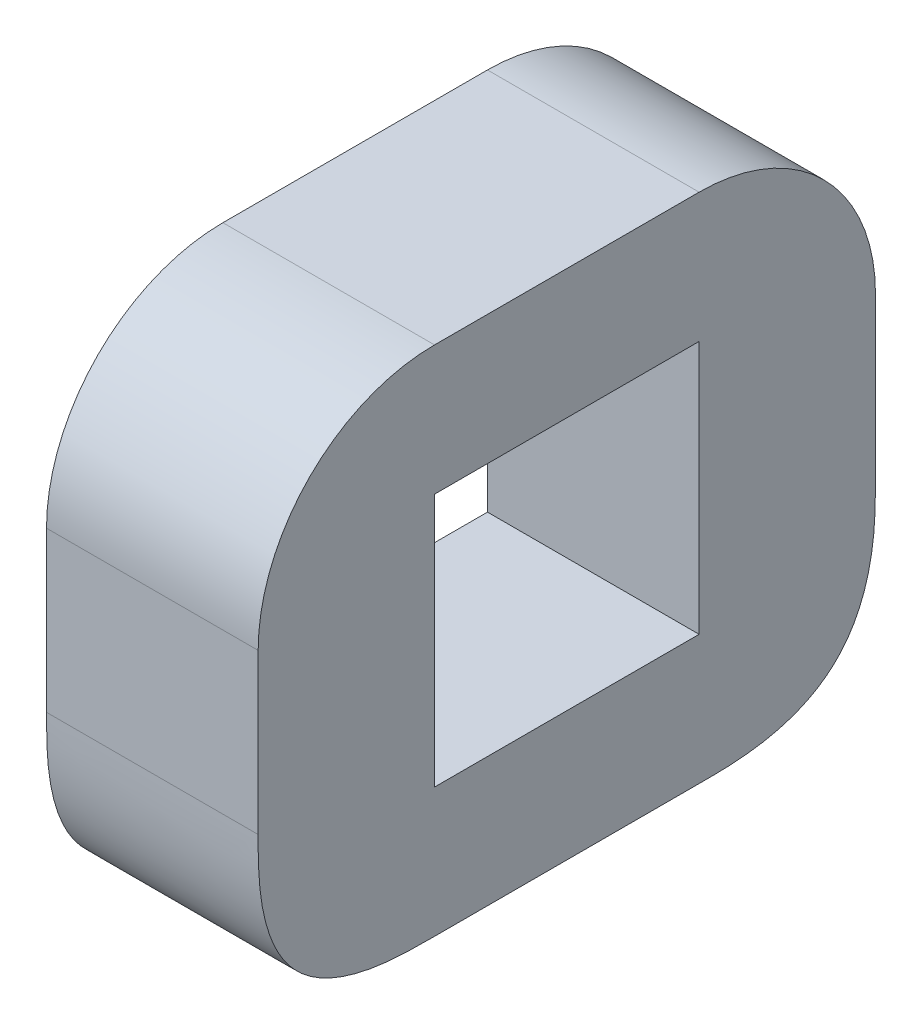
ISO-10303-21;
HEADER;
FILE_DESCRIPTION(('STEP AP214'),'2;1');
FILE_NAME('part.step','',(''),(''),'','','');
FILE_SCHEMA(('AUTOMOTIVE_DESIGN { 1 0 10303 214 1 1 1 1 }'));
ENDSEC;
DATA;
#1=APPLICATION_CONTEXT('core data for automotive mechanical design processes');
#2=APPLICATION_PROTOCOL_DEFINITION('international standard','automotive_design',2000,#1);
#3=PRODUCT_CONTEXT('',#1,'mechanical');
#4=PRODUCT('Part','Part','',(#3));
#5=PRODUCT_RELATED_PRODUCT_CATEGORY('part','',(#4));
#6=PRODUCT_DEFINITION_FORMATION('','',#4);
#7=PRODUCT_DEFINITION_CONTEXT('part definition',#1,'design');
#8=PRODUCT_DEFINITION('design','',#6,#7);
#9=PRODUCT_DEFINITION_SHAPE('','',#8);
#10=(LENGTH_UNIT() NAMED_UNIT(*) SI_UNIT(.MILLI.,.METRE.));
#11=(NAMED_UNIT(*) PLANE_ANGLE_UNIT() SI_UNIT($,.RADIAN.));
#12=(NAMED_UNIT(*) SI_UNIT($,.STERADIAN.) SOLID_ANGLE_UNIT());
#13=UNCERTAINTY_MEASURE_WITH_UNIT(LENGTH_MEASURE(1.E-05),#10,'distance_accuracy_value','');
#14=(GEOMETRIC_REPRESENTATION_CONTEXT(3) GLOBAL_UNCERTAINTY_ASSIGNED_CONTEXT((#13)) GLOBAL_UNIT_ASSIGNED_CONTEXT((#10,
#11,#12)) REPRESENTATION_CONTEXT('',''));
#15=CARTESIAN_POINT('',(0.,0.,0.));
#16=DIRECTION('',(0.,0.,1.));
#17=DIRECTION('',(1.,0.,0.));
#18=AXIS2_PLACEMENT_3D('',#15,#16,#17);
#19=CARTESIAN_POINT('',(64.5352461515029,0.979999999999967,-5.75));
#20=CARTESIAN_POINT('',(62.1352461515028,0.979999999999967,-5.75));
#21=CARTESIAN_POINT('',(59.735246151503,0.979999999999967,-5.75));
#22=CARTESIAN_POINT('',(57.3352461515029,0.979999999999967,-5.75));
#23=CARTESIAN_POINT('',(64.5352461515029,0.139009742330235,-5.75));
#24=CARTESIAN_POINT('',(62.1352461515029,0.139009742328153,-5.75000000000728));
#25=CARTESIAN_POINT('',(59.7352461515028,0.139009742329714,-5.7500000000052));
#26=CARTESIAN_POINT('',(57.3352461515029,0.139009742330234,-5.75));
#27=CARTESIAN_POINT('',(64.5352461515029,-0.701980515339497,-5.75));
#28=CARTESIAN_POINT('',(62.1352461515029,-0.7019805153434,-5.75000000000416));
#29=CARTESIAN_POINT('',(59.7352461515029,-0.701980515340799,-5.75000000000416));
#30=CARTESIAN_POINT('',(57.3352461515029,-0.701980515339498,-5.75));
#31=CARTESIAN_POINT('',(64.5352461515029,-2.55553390593277,-5.39154040081958));
#32=CARTESIAN_POINT('',(62.1352461515028,-2.55553390593641,-5.39154040082375));
#33=CARTESIAN_POINT('',(59.735246151503,-2.55553390593746,-5.39154040081542));
#34=CARTESIAN_POINT('',(57.3352461515029,-2.55553390593277,-5.39154040081958));
#35=CARTESIAN_POINT('',(64.5352461515029,-3.66154040081962,-4.28553390593274));
#36=CARTESIAN_POINT('',(62.1352461515029,-3.66154040082326,-4.28553390594523));
#37=CARTESIAN_POINT('',(59.7352461515029,-3.66154040082638,-4.28553390594106));
#38=CARTESIAN_POINT('',(57.3352461515029,-3.66154040081962,-4.28553390593274));
#39=CARTESIAN_POINT('',(64.5352461515029,-4.02000000000003,-2.43198051533946));
#40=CARTESIAN_POINT('',(62.1352461515029,-4.02000000000732,-2.43198051534363));
#41=CARTESIAN_POINT('',(59.7352461515029,-4.02000000000524,-2.43198051533946));
#42=CARTESIAN_POINT('',(57.3352461515029,-4.02000000000004,-2.43198051533946));
#43=CARTESIAN_POINT('',(64.5352461515029,-4.02000000000003,-1.59099025766973));
#44=CARTESIAN_POINT('',(62.1352461515029,-4.02000000000732,-1.59099025767181));
#45=CARTESIAN_POINT('',(59.7352461515029,-4.02000000000524,-1.59099025766973));
#46=CARTESIAN_POINT('',(57.3352461515029,-4.02000000000004,-1.59099025766973));
#47=CARTESIAN_POINT('',(64.5352461515029,-4.02000000000003,-0.749999999999999));
#48=CARTESIAN_POINT('',(62.1352461515028,-4.02000000000003,-0.749999999999999));
#49=CARTESIAN_POINT('',(59.735246151503,-4.02000000000004,-0.749999999999999));
#50=CARTESIAN_POINT('',(57.3352461515029,-4.02000000000004,-0.749999999999999));
#51=B_SPLINE_SURFACE_WITH_KNOTS('',5,3,((#19,#20,#21,#22),(#23,#24,#25,#26),(#27,#28,#29,#30),
(#31,#32,#33,#34),(#35,#36,#37,#38),(#39,#40,#41,#42),(#43,#44,#45,#46),(#47,#48,#49,#50)),
.UNSPECIFIED.,.F.,.F.,.F.,(6,2,6),(4,4),(0.,0.5,1.),(-0.000600000000000001,0.00660000000000001),.UNSPECIFIED.);
#52=CARTESIAN_POINT('',(57.3352461515029,0.979999999999967,-5.75));
#53=CARTESIAN_POINT('',(59.735246151503,0.979999999999967,-5.75));
#54=CARTESIAN_POINT('',(62.1352461515028,0.979999999999967,-5.75));
#55=CARTESIAN_POINT('',(64.5352461515029,0.979999999999967,-5.75));
#56=B_SPLINE_CURVE_WITH_KNOTS('',3,(#52,#53,#54,#55),.UNSPECIFIED.,.F.,.F.,(4,4),
(-0.000600000000000001,0.00660000000000001),.UNSPECIFIED.);
#57=CARTESIAN_POINT('',(63.9352461515029,0.979999999999967,-5.75));
#58=VERTEX_POINT('',#57);
#59=CARTESIAN_POINT('',(57.9352461515029,0.979999999999967,-5.75));
#60=VERTEX_POINT('',#59);
#61=EDGE_CURVE('E220',#58,#60,#56,.F.);
#62=CARTESIAN_POINT('',(63.9352461515029,0.979999999999967,-5.75));
#63=CARTESIAN_POINT('',(63.9352461515029,0.139009742329788,-5.75000000000163));
#64=CARTESIAN_POINT('',(63.9352461515029,-0.701980515340342,-5.75000000000095));
#65=CARTESIAN_POINT('',(63.9352461515029,-2.55553390593363,-5.39154040082038));
#66=CARTESIAN_POINT('',(63.9352461515029,-3.66154040082051,-4.28553390593552));
#67=CARTESIAN_POINT('',(63.9352461515029,-4.02000000000166,-2.43198051534034));
#68=CARTESIAN_POINT('',(63.9352461515029,-4.02000000000166,-1.59099025767017));
#69=CARTESIAN_POINT('',(63.9352461515029,-4.02000000000003,-0.749999999999999));
#70=B_SPLINE_CURVE_WITH_KNOTS('',5,(#62,#63,#64,#65,#66,#67,#68,#69),.UNSPECIFIED.,.F.,.F.,(6,2,
6),(0.,0.5,1.),.UNSPECIFIED.);
#71=CARTESIAN_POINT('',(63.9352461515029,-4.02000000000004,-0.749999999999999));
#72=VERTEX_POINT('',#71);
#73=EDGE_CURVE('E42',#72,#58,#70,.F.);
#74=CARTESIAN_POINT('',(64.5352461515029,-4.02000000000003,-0.749999999999999));
#75=CARTESIAN_POINT('',(62.1352461515028,-4.02000000000003,-0.749999999999999));
#76=CARTESIAN_POINT('',(59.735246151503,-4.02000000000004,-0.749999999999999));
#77=CARTESIAN_POINT('',(57.3352461515029,-4.02000000000004,-0.749999999999999));
#78=B_SPLINE_CURVE_WITH_KNOTS('',3,(#74,#75,#76,#77),.UNSPECIFIED.,.F.,.F.,(4,4),
(-0.000600000000000001,0.00660000000000001),.UNSPECIFIED.);
#79=CARTESIAN_POINT('',(57.9352461515029,-4.02000000000004,-0.749999999999999));
#80=VERTEX_POINT('',#79);
#81=EDGE_CURVE('E352',#80,#72,#78,.F.);
#82=CARTESIAN_POINT('',(57.9352461515029,-4.02000000000004,-0.749999999999999));
#83=CARTESIAN_POINT('',(57.9352461515028,-4.02000000000127,-1.59099025766977));
#84=CARTESIAN_POINT('',(57.9352461515028,-4.02000000000127,-2.43198051533954));
#85=CARTESIAN_POINT('',(57.9352461515028,-3.66154040082111,-4.28553390593472));
#86=CARTESIAN_POINT('',(57.9352461515029,-2.55553390593383,-5.39154040081879));
#87=CARTESIAN_POINT('',(57.9352461515028,-0.701980515339846,-5.75000000000095));
#88=CARTESIAN_POINT('',(57.9352461515028,0.139009742330085,-5.75000000000123));
#89=CARTESIAN_POINT('',(57.9352461515029,0.979999999999967,-5.75));
#90=B_SPLINE_CURVE_WITH_KNOTS('',5,(#82,#83,#84,#85,#86,#87,#88,#89),.UNSPECIFIED.,.F.,.F.,(6,2,
6),(0.,0.5,1.),.UNSPECIFIED.);
#91=EDGE_CURVE('E11',#60,#80,#90,.F.);
#92=ORIENTED_EDGE('',*,*,#61,.F.);
#93=ORIENTED_EDGE('',*,*,#73,.F.);
#94=ORIENTED_EDGE('',*,*,#81,.F.);
#95=ORIENTED_EDGE('',*,*,#91,.F.);
#96=EDGE_LOOP('',(#92,#93,#94,#95));
#97=FACE_BOUND('',#96,.T.);
#98=ADVANCED_FACE('F30',(#97),#51,.T.);
#99=CARTESIAN_POINT('',(64.5352461515029,-4.02000000000004,6.75));
#100=CARTESIAN_POINT('',(62.1352461515028,-4.02000000000004,6.75));
#101=CARTESIAN_POINT('',(59.735246151503,-4.02000000000004,6.75));
#102=CARTESIAN_POINT('',(57.3352461515029,-4.02000000000004,6.75));
#103=CARTESIAN_POINT('',(64.5352461515029,-4.02000000000004,7.59099025766973));
#104=CARTESIAN_POINT('',(62.1352461515029,-4.02000000000628,7.59099025766973));
#105=CARTESIAN_POINT('',(59.7352461515029,-4.02000000000212,7.59099025766973));
#106=CARTESIAN_POINT('',(57.3352461515029,-4.02000000000004,7.59099025766973));
#107=CARTESIAN_POINT('',(64.5352461515029,-4.02000000000004,8.43198051533946));
#108=CARTESIAN_POINT('',(62.1352461515029,-4.02000000000628,8.43198051533946));
#109=CARTESIAN_POINT('',(59.7352461515029,-4.02000000000212,8.43198051533946));
#110=CARTESIAN_POINT('',(57.3352461515029,-4.02000000000004,8.43198051533946));
#111=CARTESIAN_POINT('',(64.5352461515029,-3.66154040081962,10.2855339059327));
#112=CARTESIAN_POINT('',(62.1352461515029,-3.66154040082586,10.2855339059327));
#113=CARTESIAN_POINT('',(59.7352461515029,-3.6615404008217,10.2855339059327));
#114=CARTESIAN_POINT('',(57.3352461515029,-3.66154040081962,10.2855339059327));
#115=CARTESIAN_POINT('',(64.5352461515029,-2.55553390593277,11.3915404008196));
#116=CARTESIAN_POINT('',(62.1352461515029,-2.55553390593746,11.3915404008196));
#117=CARTESIAN_POINT('',(59.7352461515028,-2.55553390593434,11.3915404008196));
#118=CARTESIAN_POINT('',(57.3352461515029,-2.55553390593277,11.3915404008196));
#119=CARTESIAN_POINT('',(64.5352461515029,-0.7019805153395,11.75));
#120=CARTESIAN_POINT('',(62.1352461515028,-0.701980515338069,11.7500000000146));
#121=CARTESIAN_POINT('',(59.735246151503,-0.70198051533833,11.7500000000104));
#122=CARTESIAN_POINT('',(57.3352461515029,-0.7019805153395,11.75));
#123=CARTESIAN_POINT('',(64.5352461515029,0.139009742330231,11.75));
#124=CARTESIAN_POINT('',(62.1352461515029,0.139009742330752,11.7500000000146));
#125=CARTESIAN_POINT('',(59.7352461515029,0.139009742330752,11.7500000000104));
#126=CARTESIAN_POINT('',(57.3352461515029,0.139009742330231,11.75));
#127=CARTESIAN_POINT('',(64.5352461515029,0.979999999999963,11.75));
#128=CARTESIAN_POINT('',(62.1352461515028,0.979999999999963,11.75));
#129=CARTESIAN_POINT('',(59.735246151503,0.979999999999963,11.75));
#130=CARTESIAN_POINT('',(57.3352461515029,0.979999999999963,11.75));
#131=B_SPLINE_SURFACE_WITH_KNOTS('',5,3,((#99,#100,#101,#102),(#103,#104,#105,#106),(#107,#108,
#109,#110),(#111,#112,#113,#114),(#115,#116,#117,#118),(#119,#120,#121,#122),(#123,#124,#125,
#126),(#127,#128,#129,#130)),.UNSPECIFIED.,.F.,.F.,.F.,(6,2,6),(4,4),(0.,0.5,1.),
(-0.000600000000000001,0.00660000000000001),.UNSPECIFIED.);
#132=CARTESIAN_POINT('',(57.3352461515029,-4.02000000000004,6.75));
#133=CARTESIAN_POINT('',(59.735246151503,-4.02000000000004,6.75));
#134=CARTESIAN_POINT('',(62.1352461515028,-4.02000000000004,6.75));
#135=CARTESIAN_POINT('',(64.5352461515029,-4.02000000000004,6.75));
#136=B_SPLINE_CURVE_WITH_KNOTS('',3,(#132,#133,#134,#135),.UNSPECIFIED.,.F.,.F.,(4,4),
(-0.000600000000000001,0.00660000000000001),.UNSPECIFIED.);
#137=CARTESIAN_POINT('',(63.9352461515029,-4.02000000000004,6.75));
#138=VERTEX_POINT('',#137);
#139=CARTESIAN_POINT('',(57.9352461515029,-4.02000000000004,6.75));
#140=VERTEX_POINT('',#139);
#141=EDGE_CURVE('E208',#138,#140,#136,.F.);
#142=CARTESIAN_POINT('',(63.9352461515029,-4.02000000000004,6.75));
#143=CARTESIAN_POINT('',(63.9352461515029,-4.02000000000139,7.59099025766973));
#144=CARTESIAN_POINT('',(63.9352461515029,-4.02000000000139,8.43198051533946));
#145=CARTESIAN_POINT('',(63.9352461515029,-3.66154040082097,10.2855339059327));
#146=CARTESIAN_POINT('',(63.9352461515029,-2.55553390593379,11.3915404008196));
#147=CARTESIAN_POINT('',(63.9352461515029,-0.701980515339177,11.7500000000033));
#148=CARTESIAN_POINT('',(63.9352461515029,0.139009742330351,11.7500000000033));
#149=CARTESIAN_POINT('',(63.9352461515029,0.979999999999963,11.75));
#150=B_SPLINE_CURVE_WITH_KNOTS('',5,(#142,#143,#144,#145,#146,#147,#148,#149),.UNSPECIFIED.,.F.,
.F.,(6,2,6),(0.,0.5,1.),.UNSPECIFIED.);
#151=CARTESIAN_POINT('',(63.9352461515029,0.979999999999964,11.75));
#152=VERTEX_POINT('',#151);
#153=EDGE_CURVE('E221',#152,#138,#150,.F.);
#154=CARTESIAN_POINT('',(64.5352461515029,0.979999999999963,11.75));
#155=CARTESIAN_POINT('',(62.1352461515028,0.979999999999963,11.75));
#156=CARTESIAN_POINT('',(59.735246151503,0.979999999999963,11.75));
#157=CARTESIAN_POINT('',(57.3352461515029,0.979999999999963,11.75));
#158=B_SPLINE_CURVE_WITH_KNOTS('',3,(#154,#155,#156,#157),.UNSPECIFIED.,.F.,.F.,(4,4),
(-0.000600000000000001,0.00660000000000001),.UNSPECIFIED.);
#159=CARTESIAN_POINT('',(57.9352461515029,0.979999999999964,11.75));
#160=VERTEX_POINT('',#159);
#161=EDGE_CURVE('E212',#160,#152,#158,.F.);
#162=CARTESIAN_POINT('',(57.9352461515029,0.979999999999963,11.75));
#163=CARTESIAN_POINT('',(57.9352461515029,0.139009742330351,11.7500000000025));
#164=CARTESIAN_POINT('',(57.9352461515029,-0.701980515339227,11.7500000000025));
#165=CARTESIAN_POINT('',(57.9352461515029,-2.55553390593319,11.3915404008196));
#166=CARTESIAN_POINT('',(57.9352461515029,-3.66154040082018,10.2855339059327));
#167=CARTESIAN_POINT('',(57.9352461515029,-4.02000000000059,8.43198051533946));
#168=CARTESIAN_POINT('',(57.9352461515029,-4.02000000000059,7.59099025766973));
#169=CARTESIAN_POINT('',(57.9352461515029,-4.02000000000004,6.75));
#170=B_SPLINE_CURVE_WITH_KNOTS('',5,(#162,#163,#164,#165,#166,#167,#168,#169),.UNSPECIFIED.,.F.,
.F.,(6,2,6),(0.,0.5,1.),.UNSPECIFIED.);
#171=EDGE_CURVE('E216',#140,#160,#170,.F.);
#172=ORIENTED_EDGE('',*,*,#141,.F.);
#173=ORIENTED_EDGE('',*,*,#153,.F.);
#174=ORIENTED_EDGE('',*,*,#161,.F.);
#175=ORIENTED_EDGE('',*,*,#171,.F.);
#176=EDGE_LOOP('',(#172,#173,#174,#175));
#177=FACE_BOUND('',#176,.T.);
#178=ADVANCED_FACE('F225',(#177),#131,.T.);
#179=CARTESIAN_POINT('',(63.9352461515029,-4.02000000000004,11.75));
#180=DIRECTION('',(1.,0.,0.));
#181=DIRECTION('',(0.,0.,-1.));
#182=AXIS2_PLACEMENT_3D('',#179,#180,#181);
#183=PLANE('',#182);
#184=DIRECTION('',(0.,0.,-1.));
#185=VECTOR('',#184,1.);
#186=CARTESIAN_POINT('',(63.9352461515029,-4.02000000000004,11.75));
#187=LINE('',#186,#185);
#188=EDGE_CURVE('E175',#138,#72,#187,.T.);
#189=ORIENTED_EDGE('',*,*,#188,.T.);
#190=ORIENTED_EDGE('',*,*,#73,.T.);
#191=DIRECTION('',(0.,1.,0.));
#192=VECTOR('',#191,1.);
#193=CARTESIAN_POINT('',(63.9352461515029,10.5,-5.75));
#194=LINE('',#193,#192);
#195=CARTESIAN_POINT('',(63.9352461515029,5.5,-5.75));
#196=VERTEX_POINT('',#195);
#197=EDGE_CURVE('E203',#58,#196,#194,.T.);
#198=ORIENTED_EDGE('',*,*,#197,.T.);
#199=CARTESIAN_POINT('',(63.9352461515029,5.5,-0.749999999999997));
#200=DIRECTION('',(1.,0.,0.));
#201=DIRECTION('',(0.,0.,-1.));
#202=AXIS2_PLACEMENT_3D('',#199,#200,#201);
#203=CIRCLE('',#202,5.);
#204=CARTESIAN_POINT('',(63.9352461515029,10.5,-0.749999999999997));
#205=VERTEX_POINT('',#204);
#206=EDGE_CURVE('E236',#196,#205,#203,.T.);
#207=ORIENTED_EDGE('',*,*,#206,.T.);
#208=DIRECTION('',(0.,0.,1.));
#209=VECTOR('',#208,1.);
#210=CARTESIAN_POINT('',(63.9352461515029,10.5,11.75));
#211=LINE('',#210,#209);
#212=CARTESIAN_POINT('',(63.9352461515029,10.5,6.75));
#213=VERTEX_POINT('',#212);
#214=EDGE_CURVE('E190',#205,#213,#211,.T.);
#215=ORIENTED_EDGE('',*,*,#214,.T.);
#216=CARTESIAN_POINT('',(63.9352461515029,5.5,6.75));
#217=DIRECTION('',(1.,0.,0.));
#218=DIRECTION('',(0.,0.,-1.));
#219=AXIS2_PLACEMENT_3D('',#216,#217,#218);
#220=CIRCLE('',#219,5.);
#221=CARTESIAN_POINT('',(63.9352461515029,5.5,11.75));
#222=VERTEX_POINT('',#221);
#223=EDGE_CURVE('E237',#213,#222,#220,.T.);
#224=ORIENTED_EDGE('',*,*,#223,.T.);
#225=DIRECTION('',(0.,-1.,0.));
#226=VECTOR('',#225,1.);
#227=CARTESIAN_POINT('',(63.9352461515029,10.5,11.75));
#228=LINE('',#227,#226);
#229=EDGE_CURVE('E171',#222,#152,#228,.T.);
#230=ORIENTED_EDGE('',*,*,#229,.T.);
#231=ORIENTED_EDGE('',*,*,#153,.T.);
#232=EDGE_LOOP('',(#189,#190,#198,#207,#215,#224,#230,#231));
#233=FACE_BOUND('',#232,.T.);
#234=DIRECTION('',(0.,0.,-1.));
#235=VECTOR('',#234,1.);
#236=CARTESIAN_POINT('',(63.9352461515029,-0.355000000000019,6.75));
#237=LINE('',#236,#235);
#238=CARTESIAN_POINT('',(63.9352461515029,-0.355000000000019,6.75));
#239=VERTEX_POINT('',#238);
#240=CARTESIAN_POINT('',(63.9352461515029,-0.355000000000019,-0.749999999999997));
#241=VERTEX_POINT('',#240);
#242=EDGE_CURVE('E134',#239,#241,#237,.T.);
#243=ORIENTED_EDGE('',*,*,#242,.F.);
#244=DIRECTION('',(0.,-1.,0.));
#245=VECTOR('',#244,1.);
#246=CARTESIAN_POINT('',(63.9352461515029,6.83499999999998,6.75));
#247=LINE('',#246,#245);
#248=CARTESIAN_POINT('',(63.9352461515029,6.83499999999998,6.75));
#249=VERTEX_POINT('',#248);
#250=EDGE_CURVE('E124',#249,#239,#247,.T.);
#251=ORIENTED_EDGE('',*,*,#250,.F.);
#252=DIRECTION('',(0.,0.,1.));
#253=VECTOR('',#252,1.);
#254=CARTESIAN_POINT('',(63.9352461515029,6.83499999999998,6.75));
#255=LINE('',#254,#253);
#256=CARTESIAN_POINT('',(63.9352461515029,6.83499999999998,-0.749999999999997));
#257=VERTEX_POINT('',#256);
#258=EDGE_CURVE('E150',#257,#249,#255,.T.);
#259=ORIENTED_EDGE('',*,*,#258,.F.);
#260=DIRECTION('',(0.,1.,0.));
#261=VECTOR('',#260,1.);
#262=CARTESIAN_POINT('',(63.9352461515029,6.83499999999998,-0.749999999999997));
#263=LINE('',#262,#261);
#264=EDGE_CURVE('E148',#241,#257,#263,.T.);
#265=ORIENTED_EDGE('',*,*,#264,.F.);
#266=EDGE_LOOP('',(#243,#251,#259,#265));
#267=FACE_BOUND('',#266,.T.);
#268=ADVANCED_FACE('F146',(#233,#267),#183,.T.);
#269=CARTESIAN_POINT('',(57.9352461515029,-4.02000000000004,11.75));
#270=DIRECTION('',(1.,0.,0.));
#271=DIRECTION('',(0.,0.,-1.));
#272=AXIS2_PLACEMENT_3D('',#269,#270,#271);
#273=PLANE('',#272);
#274=DIRECTION('',(0.,1.,0.));
#275=VECTOR('',#274,1.);
#276=CARTESIAN_POINT('',(57.9352461515029,10.5,-5.75));
#277=LINE('',#276,#275);
#278=CARTESIAN_POINT('',(57.9352461515029,5.5,-5.75));
#279=VERTEX_POINT('',#278);
#280=EDGE_CURVE('E199',#60,#279,#277,.T.);
#281=ORIENTED_EDGE('',*,*,#280,.F.);
#282=ORIENTED_EDGE('',*,*,#91,.T.);
#283=DIRECTION('',(0.,0.,-1.));
#284=VECTOR('',#283,1.);
#285=CARTESIAN_POINT('',(57.9352461515029,-4.02000000000004,11.75));
#286=LINE('',#285,#284);
#287=EDGE_CURVE('E184',#140,#80,#286,.T.);
#288=ORIENTED_EDGE('',*,*,#287,.F.);
#289=ORIENTED_EDGE('',*,*,#171,.T.);
#290=DIRECTION('',(0.,-1.,0.));
#291=VECTOR('',#290,1.);
#292=CARTESIAN_POINT('',(57.9352461515029,10.5,11.75));
#293=LINE('',#292,#291);
#294=CARTESIAN_POINT('',(57.9352461515029,5.5,11.75));
#295=VERTEX_POINT('',#294);
#296=EDGE_CURVE('E142',#295,#160,#293,.T.);
#297=ORIENTED_EDGE('',*,*,#296,.F.);
#298=CARTESIAN_POINT('',(57.9352461515029,5.5,6.75));
#299=DIRECTION('',(1.,0.,0.));
#300=DIRECTION('',(0.,0.,-1.));
#301=AXIS2_PLACEMENT_3D('',#298,#299,#300);
#302=CIRCLE('',#301,5.);
#303=CARTESIAN_POINT('',(57.9352461515029,10.5,6.75));
#304=VERTEX_POINT('',#303);
#305=EDGE_CURVE('E250',#295,#304,#302,.F.);
#306=ORIENTED_EDGE('',*,*,#305,.T.);
#307=DIRECTION('',(0.,0.,1.));
#308=VECTOR('',#307,1.);
#309=CARTESIAN_POINT('',(57.9352461515029,10.5,11.75));
#310=LINE('',#309,#308);
#311=CARTESIAN_POINT('',(57.9352461515029,10.5,-0.749999999999997));
#312=VERTEX_POINT('',#311);
#313=EDGE_CURVE('E176',#312,#304,#310,.T.);
#314=ORIENTED_EDGE('',*,*,#313,.F.);
#315=CARTESIAN_POINT('',(57.9352461515029,5.5,-0.749999999999997));
#316=DIRECTION('',(1.,0.,0.));
#317=DIRECTION('',(0.,0.,-1.));
#318=AXIS2_PLACEMENT_3D('',#315,#316,#317);
#319=CIRCLE('',#318,5.);
#320=EDGE_CURVE('E247',#312,#279,#319,.F.);
#321=ORIENTED_EDGE('',*,*,#320,.T.);
#322=EDGE_LOOP('',(#281,#282,#288,#289,#297,#306,#314,#321));
#323=FACE_BOUND('',#322,.T.);
#324=DIRECTION('',(0.,-1.,0.));
#325=VECTOR('',#324,1.);
#326=CARTESIAN_POINT('',(57.9352461515029,6.83499999999998,6.75));
#327=LINE('',#326,#325);
#328=CARTESIAN_POINT('',(57.9352461515029,6.83499999999998,6.75));
#329=VERTEX_POINT('',#328);
#330=CARTESIAN_POINT('',(57.9352461515029,-0.355000000000019,6.75));
#331=VERTEX_POINT('',#330);
#332=EDGE_CURVE('E154',#329,#331,#327,.T.);
#333=ORIENTED_EDGE('',*,*,#332,.T.);
#334=DIRECTION('',(0.,0.,-1.));
#335=VECTOR('',#334,1.);
#336=CARTESIAN_POINT('',(57.9352461515029,-0.355000000000019,6.75));
#337=LINE('',#336,#335);
#338=CARTESIAN_POINT('',(57.9352461515029,-0.355000000000019,-0.749999999999997));
#339=VERTEX_POINT('',#338);
#340=EDGE_CURVE('E141',#331,#339,#337,.T.);
#341=ORIENTED_EDGE('',*,*,#340,.T.);
#342=DIRECTION('',(0.,1.,0.));
#343=VECTOR('',#342,1.);
#344=CARTESIAN_POINT('',(57.9352461515029,6.83499999999998,-0.749999999999997));
#345=LINE('',#344,#343);
#346=CARTESIAN_POINT('',(57.9352461515029,6.83499999999998,-0.749999999999997));
#347=VERTEX_POINT('',#346);
#348=EDGE_CURVE('E157',#339,#347,#345,.T.);
#349=ORIENTED_EDGE('',*,*,#348,.T.);
#350=DIRECTION('',(0.,0.,1.));
#351=VECTOR('',#350,1.);
#352=CARTESIAN_POINT('',(57.9352461515029,6.83499999999998,6.75));
#353=LINE('',#352,#351);
#354=EDGE_CURVE('E135',#347,#329,#353,.T.);
#355=ORIENTED_EDGE('',*,*,#354,.T.);
#356=EDGE_LOOP('',(#333,#341,#349,#355));
#357=FACE_BOUND('',#356,.T.);
#358=ADVANCED_FACE('F213',(#323,#357),#273,.F.);
#359=CARTESIAN_POINT('',(63.9352461515029,10.5,11.75));
#360=DIRECTION('',(0.,0.,-1.));
#361=DIRECTION('',(-1.,0.,0.));
#362=AXIS2_PLACEMENT_3D('',#359,#360,#361);
#363=PLANE('',#362);
#364=ORIENTED_EDGE('',*,*,#296,.T.);
#365=ORIENTED_EDGE('',*,*,#161,.T.);
#366=ORIENTED_EDGE('',*,*,#229,.F.);
#367=DIRECTION('',(-1.,0.,0.));
#368=VECTOR('',#367,1.);
#369=CARTESIAN_POINT('',(63.9352461515029,5.5,11.75));
#370=LINE('',#369,#368);
#371=EDGE_CURVE('E200',#222,#295,#370,.T.);
#372=ORIENTED_EDGE('',*,*,#371,.T.);
#373=EDGE_LOOP('',(#364,#365,#366,#372));
#374=FACE_BOUND('',#373,.T.);
#375=ADVANCED_FACE('F232',(#374),#363,.F.);
#376=CARTESIAN_POINT('',(63.9352461515029,-4.02000000000004,11.75));
#377=DIRECTION('',(0.,1.,0.));
#378=DIRECTION('',(0.,0.,1.));
#379=AXIS2_PLACEMENT_3D('',#376,#377,#378);
#380=PLANE('',#379);
#381=ORIENTED_EDGE('',*,*,#287,.T.);
#382=ORIENTED_EDGE('',*,*,#81,.T.);
#383=ORIENTED_EDGE('',*,*,#188,.F.);
#384=ORIENTED_EDGE('',*,*,#141,.T.);
#385=EDGE_LOOP('',(#381,#382,#383,#384));
#386=FACE_BOUND('',#385,.T.);
#387=ADVANCED_FACE('F209',(#386),#380,.F.);
#388=CARTESIAN_POINT('',(63.9352461515029,10.5,-5.75));
#389=DIRECTION('',(0.,0.,1.));
#390=DIRECTION('',(0.,-1.,0.));
#391=AXIS2_PLACEMENT_3D('',#388,#389,#390);
#392=PLANE('',#391);
#393=ORIENTED_EDGE('',*,*,#197,.F.);
#394=ORIENTED_EDGE('',*,*,#61,.T.);
#395=ORIENTED_EDGE('',*,*,#280,.T.);
#396=DIRECTION('',(-1.,0.,0.));
#397=VECTOR('',#396,1.);
#398=CARTESIAN_POINT('',(63.9352461515029,5.5,-5.75));
#399=LINE('',#398,#397);
#400=EDGE_CURVE('E242',#279,#196,#399,.F.);
#401=ORIENTED_EDGE('',*,*,#400,.T.);
#402=EDGE_LOOP('',(#393,#394,#395,#401));
#403=FACE_BOUND('',#402,.T.);
#404=ADVANCED_FACE('F276',(#403),#392,.F.);
#405=CARTESIAN_POINT('',(63.9352461515029,10.5,11.75));
#406=DIRECTION('',(0.,-1.,0.));
#407=DIRECTION('',(0.,0.,-1.));
#408=AXIS2_PLACEMENT_3D('',#405,#406,#407);
#409=PLANE('',#408);
#410=ORIENTED_EDGE('',*,*,#214,.F.);
#411=DIRECTION('',(-1.,0.,0.));
#412=VECTOR('',#411,1.);
#413=CARTESIAN_POINT('',(63.9352461515029,10.5,-0.749999999999997));
#414=LINE('',#413,#412);
#415=EDGE_CURVE('E252',#205,#312,#414,.T.);
#416=ORIENTED_EDGE('',*,*,#415,.T.);
#417=ORIENTED_EDGE('',*,*,#313,.T.);
#418=DIRECTION('',(-1.,0.,0.));
#419=VECTOR('',#418,1.);
#420=CARTESIAN_POINT('',(63.9352461515029,10.5,6.75));
#421=LINE('',#420,#419);
#422=EDGE_CURVE('E255',#304,#213,#421,.F.);
#423=ORIENTED_EDGE('',*,*,#422,.T.);
#424=EDGE_LOOP('',(#410,#416,#417,#423));
#425=FACE_BOUND('',#424,.T.);
#426=ADVANCED_FACE('F285',(#425),#409,.F.);
#427=CARTESIAN_POINT('',(63.9352461515029,6.83499999999998,6.75));
#428=DIRECTION('',(0.,0.,-1.));
#429=DIRECTION('',(-1.,0.,0.));
#430=AXIS2_PLACEMENT_3D('',#427,#428,#429);
#431=PLANE('',#430);
#432=ORIENTED_EDGE('',*,*,#332,.F.);
#433=DIRECTION('',(-1.,0.,0.));
#434=VECTOR('',#433,1.);
#435=CARTESIAN_POINT('',(63.9352461515029,6.83499999999998,6.75));
#436=LINE('',#435,#434);
#437=EDGE_CURVE('E130',#249,#329,#436,.T.);
#438=ORIENTED_EDGE('',*,*,#437,.F.);
#439=ORIENTED_EDGE('',*,*,#250,.T.);
#440=DIRECTION('',(-1.,0.,0.));
#441=VECTOR('',#440,1.);
#442=CARTESIAN_POINT('',(63.9352461515029,-0.355000000000019,6.75));
#443=LINE('',#442,#441);
#444=EDGE_CURVE('E127',#239,#331,#443,.T.);
#445=ORIENTED_EDGE('',*,*,#444,.T.);
#446=EDGE_LOOP('',(#432,#438,#439,#445));
#447=FACE_BOUND('',#446,.T.);
#448=ADVANCED_FACE('F126',(#447),#431,.T.);
#449=CARTESIAN_POINT('',(63.9352461515029,-0.355000000000019,6.75));
#450=DIRECTION('',(0.,1.,0.));
#451=DIRECTION('',(0.,0.,1.));
#452=AXIS2_PLACEMENT_3D('',#449,#450,#451);
#453=PLANE('',#452);
#454=ORIENTED_EDGE('',*,*,#340,.F.);
#455=ORIENTED_EDGE('',*,*,#444,.F.);
#456=ORIENTED_EDGE('',*,*,#242,.T.);
#457=DIRECTION('',(-1.,0.,0.));
#458=VECTOR('',#457,1.);
#459=CARTESIAN_POINT('',(63.9352461515029,-0.355000000000019,-0.749999999999997));
#460=LINE('',#459,#458);
#461=EDGE_CURVE('E143',#241,#339,#460,.T.);
#462=ORIENTED_EDGE('',*,*,#461,.T.);
#463=EDGE_LOOP('',(#454,#455,#456,#462));
#464=FACE_BOUND('',#463,.T.);
#465=ADVANCED_FACE('F138',(#464),#453,.T.);
#466=CARTESIAN_POINT('',(63.9352461515029,6.83499999999998,-0.749999999999997));
#467=DIRECTION('',(0.,0.,1.));
#468=DIRECTION('',(1.,0.,0.));
#469=AXIS2_PLACEMENT_3D('',#466,#467,#468);
#470=PLANE('',#469);
#471=ORIENTED_EDGE('',*,*,#348,.F.);
#472=ORIENTED_EDGE('',*,*,#461,.F.);
#473=ORIENTED_EDGE('',*,*,#264,.T.);
#474=DIRECTION('',(-1.,0.,0.));
#475=VECTOR('',#474,1.);
#476=CARTESIAN_POINT('',(63.9352461515029,6.83499999999998,-0.749999999999997));
#477=LINE('',#476,#475);
#478=EDGE_CURVE('E163',#257,#347,#477,.T.);
#479=ORIENTED_EDGE('',*,*,#478,.T.);
#480=EDGE_LOOP('',(#471,#472,#473,#479));
#481=FACE_BOUND('',#480,.T.);
#482=ADVANCED_FACE('F344',(#481),#470,.T.);
#483=CARTESIAN_POINT('',(63.9352461515029,6.83499999999998,6.75));
#484=DIRECTION('',(0.,-1.,0.));
#485=DIRECTION('',(0.,0.,-1.));
#486=AXIS2_PLACEMENT_3D('',#483,#484,#485);
#487=PLANE('',#486);
#488=ORIENTED_EDGE('',*,*,#354,.F.);
#489=ORIENTED_EDGE('',*,*,#478,.F.);
#490=ORIENTED_EDGE('',*,*,#258,.T.);
#491=ORIENTED_EDGE('',*,*,#437,.T.);
#492=EDGE_LOOP('',(#488,#489,#490,#491));
#493=FACE_BOUND('',#492,.T.);
#494=ADVANCED_FACE('F338',(#493),#487,.T.);
#495=CARTESIAN_POINT('',(63.9352461515029,5.5,-0.749999999999997));
#496=DIRECTION('',(-1.,0.,0.));
#497=DIRECTION('',(0.,0.,1.));
#498=AXIS2_PLACEMENT_3D('',#495,#496,#497);
#499=CYLINDRICAL_SURFACE('',#498,5.);
#500=ORIENTED_EDGE('',*,*,#206,.F.);
#501=ORIENTED_EDGE('',*,*,#400,.F.);
#502=ORIENTED_EDGE('',*,*,#320,.F.);
#503=ORIENTED_EDGE('',*,*,#415,.F.);
#504=EDGE_LOOP('',(#500,#501,#502,#503));
#505=FACE_BOUND('',#504,.T.);
#506=ADVANCED_FACE('F335',(#505),#499,.T.);
#507=CARTESIAN_POINT('',(63.9352461515029,5.5,6.75));
#508=DIRECTION('',(-1.,0.,0.));
#509=DIRECTION('',(0.,0.,1.));
#510=AXIS2_PLACEMENT_3D('',#507,#508,#509);
#511=CYLINDRICAL_SURFACE('',#510,5.);
#512=ORIENTED_EDGE('',*,*,#223,.F.);
#513=ORIENTED_EDGE('',*,*,#422,.F.);
#514=ORIENTED_EDGE('',*,*,#305,.F.);
#515=ORIENTED_EDGE('',*,*,#371,.F.);
#516=EDGE_LOOP('',(#512,#513,#514,#515));
#517=FACE_BOUND('',#516,.T.);
#518=ADVANCED_FACE('F332',(#517),#511,.T.);
#519=CLOSED_SHELL('',(#98,#178,#268,#358,#375,#387,#404,#426,#448,#465,#482,#494,#506,#518));
#520=MANIFOLD_SOLID_BREP('B2',#519);
#521=ADVANCED_BREP_SHAPE_REPRESENTATION('',(#18,#520),#14);
#522=SHAPE_DEFINITION_REPRESENTATION(#9,#521);
ENDSEC;
END-ISO-10303-21;
